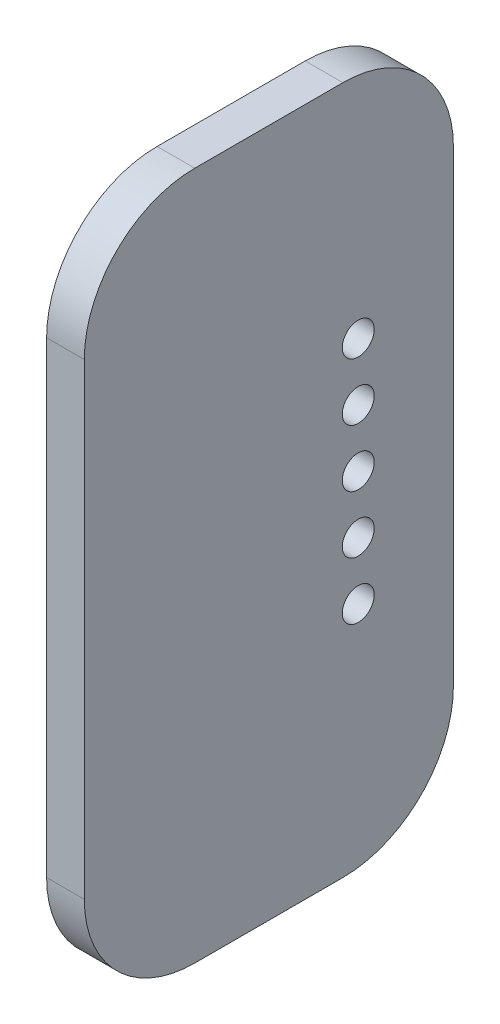
ISO-10303-21;
HEADER;
FILE_DESCRIPTION(('STEP AP214'),'2;1');
FILE_NAME('part.step','',(''),(''),'','','');
FILE_SCHEMA(('AUTOMOTIVE_DESIGN { 1 0 10303 214 1 1 1 1 }'));
ENDSEC;
DATA;
#1=APPLICATION_CONTEXT('core data for automotive mechanical design processes');
#2=APPLICATION_PROTOCOL_DEFINITION('international standard','automotive_design',2000,#1);
#3=PRODUCT_CONTEXT('',#1,'mechanical');
#4=PRODUCT('Part','Part','',(#3));
#5=PRODUCT_RELATED_PRODUCT_CATEGORY('part','',(#4));
#6=PRODUCT_DEFINITION_FORMATION('','',#4);
#7=PRODUCT_DEFINITION_CONTEXT('part definition',#1,'design');
#8=PRODUCT_DEFINITION('design','',#6,#7);
#9=PRODUCT_DEFINITION_SHAPE('','',#8);
#10=(LENGTH_UNIT() NAMED_UNIT(*) SI_UNIT(.MILLI.,.METRE.));
#11=(NAMED_UNIT(*) PLANE_ANGLE_UNIT() SI_UNIT($,.RADIAN.));
#12=(NAMED_UNIT(*) SI_UNIT($,.STERADIAN.) SOLID_ANGLE_UNIT());
#13=UNCERTAINTY_MEASURE_WITH_UNIT(LENGTH_MEASURE(1.E-05),#10,'distance_accuracy_value','');
#14=(GEOMETRIC_REPRESENTATION_CONTEXT(3) GLOBAL_UNCERTAINTY_ASSIGNED_CONTEXT((#13)) GLOBAL_UNIT_ASSIGNED_CONTEXT((#10,
#11,#12)) REPRESENTATION_CONTEXT('',''));
#15=CARTESIAN_POINT('',(0.,0.,0.));
#16=DIRECTION('',(0.,0.,1.));
#17=DIRECTION('',(1.,0.,0.));
#18=AXIS2_PLACEMENT_3D('',#15,#16,#17);
#19=CARTESIAN_POINT('',(36.95,-18.3000899385989,26.1999100614011));
#20=DIRECTION('',(-1.,0.,0.));
#21=DIRECTION('',(0.,0.,1.));
#22=AXIS2_PLACEMENT_3D('',#19,#20,#21);
#23=CYLINDRICAL_SURFACE('',#22,8.64991006186864);
#24=CARTESIAN_POINT('',(34.,-18.3000899385989,26.1999100614011));
#25=DIRECTION('',(1.,0.,0.));
#26=DIRECTION('',(0.,0.,-1.));
#27=AXIS2_PLACEMENT_3D('',#24,#25,#26);
#28=CIRCLE('',#27,8.64991006186864);
#29=CARTESIAN_POINT('',(34.,-26.95,26.2));
#30=VERTEX_POINT('',#29);
#31=CARTESIAN_POINT('',(34.,-18.3,17.55));
#32=VERTEX_POINT('',#31);
#33=EDGE_CURVE('E139',#30,#32,#28,.T.);
#34=ORIENTED_EDGE('',*,*,#33,.T.);
#35=DIRECTION('',(-1.,0.,0.));
#36=VECTOR('',#35,1.);
#37=CARTESIAN_POINT('',(36.95,-18.3,17.55));
#38=LINE('',#37,#36);
#39=CARTESIAN_POINT('',(36.95,-18.3,17.55));
#40=VERTEX_POINT('',#39);
#41=EDGE_CURVE('E11',#40,#32,#38,.T.);
#42=ORIENTED_EDGE('',*,*,#41,.F.);
#43=CARTESIAN_POINT('',(36.95,-18.3000899385989,26.1999100614011));
#44=DIRECTION('',(1.,0.,0.));
#45=DIRECTION('',(0.,0.,-1.));
#46=AXIS2_PLACEMENT_3D('',#43,#44,#45);
#47=CIRCLE('',#46,8.64991006186864);
#48=CARTESIAN_POINT('',(36.95,-26.95,26.2));
#49=VERTEX_POINT('',#48);
#50=EDGE_CURVE('E155',#49,#40,#47,.T.);
#51=ORIENTED_EDGE('',*,*,#50,.F.);
#52=DIRECTION('',(-1.,0.,0.));
#53=VECTOR('',#52,1.);
#54=CARTESIAN_POINT('',(36.95,-26.95,26.2));
#55=LINE('',#54,#53);
#56=EDGE_CURVE('E134',#49,#30,#55,.T.);
#57=ORIENTED_EDGE('',*,*,#56,.T.);
#58=EDGE_LOOP('',(#34,#42,#51,#57));
#59=FACE_BOUND('',#58,.T.);
#60=ADVANCED_FACE('F39',(#59),#23,.T.);
#61=CARTESIAN_POINT('',(36.95,-18.3,17.55));
#62=DIRECTION('',(0.,0.,1.));
#63=DIRECTION('',(1.,0.,0.));
#64=AXIS2_PLACEMENT_3D('',#61,#62,#63);
#65=PLANE('',#64);
#66=DIRECTION('',(0.,1.,0.));
#67=VECTOR('',#66,1.);
#68=CARTESIAN_POINT('',(34.,-18.3,17.55));
#69=LINE('',#68,#67);
#70=CARTESIAN_POINT('',(34.,18.3,17.55));
#71=VERTEX_POINT('',#70);
#72=EDGE_CURVE('E136',#32,#71,#69,.T.);
#73=ORIENTED_EDGE('',*,*,#72,.T.);
#74=DIRECTION('',(-1.,0.,0.));
#75=VECTOR('',#74,1.);
#76=CARTESIAN_POINT('',(36.95,18.3,17.55));
#77=LINE('',#76,#75);
#78=CARTESIAN_POINT('',(36.95,18.3,17.55));
#79=VERTEX_POINT('',#78);
#80=EDGE_CURVE('E48',#79,#71,#77,.T.);
#81=ORIENTED_EDGE('',*,*,#80,.F.);
#82=DIRECTION('',(0.,1.,0.));
#83=VECTOR('',#82,1.);
#84=CARTESIAN_POINT('',(36.95,-18.3,17.55));
#85=LINE('',#84,#83);
#86=EDGE_CURVE('E99',#40,#79,#85,.T.);
#87=ORIENTED_EDGE('',*,*,#86,.F.);
#88=ORIENTED_EDGE('',*,*,#41,.T.);
#89=EDGE_LOOP('',(#73,#81,#87,#88));
#90=FACE_BOUND('',#89,.T.);
#91=ADVANCED_FACE('F229',(#90),#65,.F.);
#92=CARTESIAN_POINT('',(36.95,18.3000899385989,26.1999100614011));
#93=DIRECTION('',(-1.,0.,0.));
#94=DIRECTION('',(0.,0.,1.));
#95=AXIS2_PLACEMENT_3D('',#92,#93,#94);
#96=CYLINDRICAL_SURFACE('',#95,8.64991006186864);
#97=CARTESIAN_POINT('',(34.,18.3000899385989,26.1999100614011));
#98=DIRECTION('',(1.,0.,0.));
#99=DIRECTION('',(0.,0.,-1.));
#100=AXIS2_PLACEMENT_3D('',#97,#98,#99);
#101=CIRCLE('',#100,8.64991006186864);
#102=CARTESIAN_POINT('',(34.,26.95,26.2));
#103=VERTEX_POINT('',#102);
#104=EDGE_CURVE('E141',#71,#103,#101,.T.);
#105=ORIENTED_EDGE('',*,*,#104,.T.);
#106=DIRECTION('',(-1.,0.,0.));
#107=VECTOR('',#106,1.);
#108=CARTESIAN_POINT('',(36.95,26.95,26.2));
#109=LINE('',#108,#107);
#110=CARTESIAN_POINT('',(36.95,26.95,26.2));
#111=VERTEX_POINT('',#110);
#112=EDGE_CURVE('E157',#111,#103,#109,.T.);
#113=ORIENTED_EDGE('',*,*,#112,.F.);
#114=CARTESIAN_POINT('',(36.95,18.3000899385989,26.1999100614011));
#115=DIRECTION('',(1.,0.,0.));
#116=DIRECTION('',(0.,0.,-1.));
#117=AXIS2_PLACEMENT_3D('',#114,#115,#116);
#118=CIRCLE('',#117,8.64991006186864);
#119=EDGE_CURVE('E198',#79,#111,#118,.T.);
#120=ORIENTED_EDGE('',*,*,#119,.F.);
#121=ORIENTED_EDGE('',*,*,#80,.T.);
#122=EDGE_LOOP('',(#105,#113,#120,#121));
#123=FACE_BOUND('',#122,.T.);
#124=ADVANCED_FACE('F234',(#123),#96,.T.);
#125=CARTESIAN_POINT('',(36.95,26.95,26.2));
#126=DIRECTION('',(0.,-1.,0.));
#127=DIRECTION('',(0.,0.,-1.));
#128=AXIS2_PLACEMENT_3D('',#125,#126,#127);
#129=PLANE('',#128);
#130=DIRECTION('',(0.,0.,1.));
#131=VECTOR('',#130,1.);
#132=CARTESIAN_POINT('',(34.,26.95,26.2));
#133=LINE('',#132,#131);
#134=CARTESIAN_POINT('',(34.,26.95,37.8));
#135=VERTEX_POINT('',#134);
#136=EDGE_CURVE('E144',#103,#135,#133,.T.);
#137=ORIENTED_EDGE('',*,*,#136,.T.);
#138=DIRECTION('',(-1.,0.,0.));
#139=VECTOR('',#138,1.);
#140=CARTESIAN_POINT('',(36.95,26.95,37.8));
#141=LINE('',#140,#139);
#142=CARTESIAN_POINT('',(36.95,26.95,37.8));
#143=VERTEX_POINT('',#142);
#144=EDGE_CURVE('E156',#143,#135,#141,.T.);
#145=ORIENTED_EDGE('',*,*,#144,.F.);
#146=DIRECTION('',(0.,0.,1.));
#147=VECTOR('',#146,1.);
#148=CARTESIAN_POINT('',(36.95,26.95,26.2));
#149=LINE('',#148,#147);
#150=EDGE_CURVE('E196',#111,#143,#149,.T.);
#151=ORIENTED_EDGE('',*,*,#150,.F.);
#152=ORIENTED_EDGE('',*,*,#112,.T.);
#153=EDGE_LOOP('',(#137,#145,#151,#152));
#154=FACE_BOUND('',#153,.T.);
#155=ADVANCED_FACE('F204',(#154),#129,.F.);
#156=CARTESIAN_POINT('',(36.95,18.3000899385989,37.8000899385989));
#157=DIRECTION('',(-1.,0.,0.));
#158=DIRECTION('',(0.,0.,1.));
#159=AXIS2_PLACEMENT_3D('',#156,#157,#158);
#160=CYLINDRICAL_SURFACE('',#159,8.64991006186864);
#161=CARTESIAN_POINT('',(34.,18.3000899385989,37.8000899385989));
#162=DIRECTION('',(1.,0.,0.));
#163=DIRECTION('',(0.,0.,-1.));
#164=AXIS2_PLACEMENT_3D('',#161,#162,#163);
#165=CIRCLE('',#164,8.64991006186864);
#166=CARTESIAN_POINT('',(34.,18.3,46.45));
#167=VERTEX_POINT('',#166);
#168=EDGE_CURVE('E150',#135,#167,#165,.T.);
#169=ORIENTED_EDGE('',*,*,#168,.T.);
#170=DIRECTION('',(-1.,0.,0.));
#171=VECTOR('',#170,1.);
#172=CARTESIAN_POINT('',(36.95,18.3,46.45));
#173=LINE('',#172,#171);
#174=CARTESIAN_POINT('',(36.95,18.3,46.45));
#175=VERTEX_POINT('',#174);
#176=EDGE_CURVE('E126',#175,#167,#173,.T.);
#177=ORIENTED_EDGE('',*,*,#176,.F.);
#178=CARTESIAN_POINT('',(36.95,18.3000899385989,37.8000899385989));
#179=DIRECTION('',(1.,0.,0.));
#180=DIRECTION('',(0.,0.,-1.));
#181=AXIS2_PLACEMENT_3D('',#178,#179,#180);
#182=CIRCLE('',#181,8.64991006186864);
#183=EDGE_CURVE('E118',#143,#175,#182,.T.);
#184=ORIENTED_EDGE('',*,*,#183,.F.);
#185=ORIENTED_EDGE('',*,*,#144,.T.);
#186=EDGE_LOOP('',(#169,#177,#184,#185));
#187=FACE_BOUND('',#186,.T.);
#188=ADVANCED_FACE('F208',(#187),#160,.T.);
#189=CARTESIAN_POINT('',(36.95,18.3,46.45));
#190=DIRECTION('',(0.,0.,-1.));
#191=DIRECTION('',(-1.,0.,0.));
#192=AXIS2_PLACEMENT_3D('',#189,#190,#191);
#193=PLANE('',#192);
#194=DIRECTION('',(0.,-1.,0.));
#195=VECTOR('',#194,1.);
#196=CARTESIAN_POINT('',(34.,18.3,46.45));
#197=LINE('',#196,#195);
#198=CARTESIAN_POINT('',(34.,-18.3,46.45));
#199=VERTEX_POINT('',#198);
#200=EDGE_CURVE('E130',#167,#199,#197,.T.);
#201=ORIENTED_EDGE('',*,*,#200,.T.);
#202=DIRECTION('',(-1.,0.,0.));
#203=VECTOR('',#202,1.);
#204=CARTESIAN_POINT('',(36.95,-18.3,46.45));
#205=LINE('',#204,#203);
#206=CARTESIAN_POINT('',(36.95,-18.3,46.45));
#207=VERTEX_POINT('',#206);
#208=EDGE_CURVE('E125',#207,#199,#205,.T.);
#209=ORIENTED_EDGE('',*,*,#208,.F.);
#210=DIRECTION('',(0.,-1.,0.));
#211=VECTOR('',#210,1.);
#212=CARTESIAN_POINT('',(36.95,18.3,46.45));
#213=LINE('',#212,#211);
#214=EDGE_CURVE('E114',#175,#207,#213,.T.);
#215=ORIENTED_EDGE('',*,*,#214,.F.);
#216=ORIENTED_EDGE('',*,*,#176,.T.);
#217=EDGE_LOOP('',(#201,#209,#215,#216));
#218=FACE_BOUND('',#217,.T.);
#219=ADVANCED_FACE('F121',(#218),#193,.F.);
#220=CARTESIAN_POINT('',(36.95,-18.3000899385989,37.8000899385989));
#221=DIRECTION('',(-1.,0.,0.));
#222=DIRECTION('',(0.,0.,1.));
#223=AXIS2_PLACEMENT_3D('',#220,#221,#222);
#224=CYLINDRICAL_SURFACE('',#223,8.64991006186865);
#225=CARTESIAN_POINT('',(34.,-18.3000899385989,37.8000899385989));
#226=DIRECTION('',(1.,0.,0.));
#227=DIRECTION('',(0.,0.,-1.));
#228=AXIS2_PLACEMENT_3D('',#225,#226,#227);
#229=CIRCLE('',#228,8.64991006186865);
#230=CARTESIAN_POINT('',(34.,-26.95,37.8));
#231=VERTEX_POINT('',#230);
#232=EDGE_CURVE('E88',#199,#231,#229,.T.);
#233=ORIENTED_EDGE('',*,*,#232,.T.);
#234=DIRECTION('',(-1.,0.,0.));
#235=VECTOR('',#234,1.);
#236=CARTESIAN_POINT('',(36.95,-26.95,37.8));
#237=LINE('',#236,#235);
#238=CARTESIAN_POINT('',(36.95,-26.95,37.8));
#239=VERTEX_POINT('',#238);
#240=EDGE_CURVE('E129',#239,#231,#237,.T.);
#241=ORIENTED_EDGE('',*,*,#240,.F.);
#242=CARTESIAN_POINT('',(36.95,-18.3000899385989,37.8000899385989));
#243=DIRECTION('',(1.,0.,0.));
#244=DIRECTION('',(0.,0.,-1.));
#245=AXIS2_PLACEMENT_3D('',#242,#243,#244);
#246=CIRCLE('',#245,8.64991006186865);
#247=EDGE_CURVE('E117',#207,#239,#246,.T.);
#248=ORIENTED_EDGE('',*,*,#247,.F.);
#249=ORIENTED_EDGE('',*,*,#208,.T.);
#250=EDGE_LOOP('',(#233,#241,#248,#249));
#251=FACE_BOUND('',#250,.T.);
#252=ADVANCED_FACE('F131',(#251),#224,.T.);
#253=CARTESIAN_POINT('',(36.95,-26.95,37.8));
#254=DIRECTION('',(0.,1.,0.));
#255=DIRECTION('',(0.,0.,1.));
#256=AXIS2_PLACEMENT_3D('',#253,#254,#255);
#257=PLANE('',#256);
#258=DIRECTION('',(0.,0.,-1.));
#259=VECTOR('',#258,1.);
#260=CARTESIAN_POINT('',(34.,-26.95,37.8));
#261=LINE('',#260,#259);
#262=EDGE_CURVE('E95',#231,#30,#261,.T.);
#263=ORIENTED_EDGE('',*,*,#262,.T.);
#264=ORIENTED_EDGE('',*,*,#56,.F.);
#265=DIRECTION('',(0.,0.,-1.));
#266=VECTOR('',#265,1.);
#267=CARTESIAN_POINT('',(36.95,-26.95,37.8));
#268=LINE('',#267,#266);
#269=EDGE_CURVE('E60',#239,#49,#268,.T.);
#270=ORIENTED_EDGE('',*,*,#269,.F.);
#271=ORIENTED_EDGE('',*,*,#240,.T.);
#272=EDGE_LOOP('',(#263,#264,#270,#271));
#273=FACE_BOUND('',#272,.T.);
#274=ADVANCED_FACE('F216',(#273),#257,.F.);
#275=CARTESIAN_POINT('',(36.95,-18.3000899385989,26.1999100614011));
#276=DIRECTION('',(1.,0.,0.));
#277=DIRECTION('',(0.,0.,-1.));
#278=AXIS2_PLACEMENT_3D('',#275,#276,#277);
#279=PLANE('',#278);
#280=CARTESIAN_POINT('',(36.95,9.,25.));
#281=DIRECTION('',(1.,0.,0.));
#282=DIRECTION('',(0.,0.,-1.));
#283=AXIS2_PLACEMENT_3D('',#280,#281,#282);
#284=CIRCLE('',#283,1.25);
#285=CARTESIAN_POINT('',(36.95,9.,23.75));
#286=VERTEX_POINT('',#285);
#287=EDGE_CURVE('E179',#286,#286,#284,.F.);
#288=ORIENTED_EDGE('',*,*,#287,.T.);
#289=EDGE_LOOP('',(#288));
#290=FACE_BOUND('',#289,.T.);
#291=CARTESIAN_POINT('',(36.95,4.5,25.));
#292=DIRECTION('',(1.,0.,0.));
#293=DIRECTION('',(0.,0.,-1.));
#294=AXIS2_PLACEMENT_3D('',#291,#292,#293);
#295=CIRCLE('',#294,1.25);
#296=CARTESIAN_POINT('',(36.95,4.5,23.75));
#297=VERTEX_POINT('',#296);
#298=EDGE_CURVE('E173',#297,#297,#295,.F.);
#299=ORIENTED_EDGE('',*,*,#298,.T.);
#300=EDGE_LOOP('',(#299));
#301=FACE_BOUND('',#300,.T.);
#302=CARTESIAN_POINT('',(36.95,0.,25.));
#303=DIRECTION('',(1.,0.,0.));
#304=DIRECTION('',(0.,0.,-1.));
#305=AXIS2_PLACEMENT_3D('',#302,#303,#304);
#306=CIRCLE('',#305,1.25);
#307=CARTESIAN_POINT('',(36.95,0.,23.75));
#308=VERTEX_POINT('',#307);
#309=EDGE_CURVE('E171',#308,#308,#306,.F.);
#310=ORIENTED_EDGE('',*,*,#309,.T.);
#311=EDGE_LOOP('',(#310));
#312=FACE_BOUND('',#311,.T.);
#313=CARTESIAN_POINT('',(36.95,-4.5,25.));
#314=DIRECTION('',(1.,0.,0.));
#315=DIRECTION('',(0.,0.,-1.));
#316=AXIS2_PLACEMENT_3D('',#313,#314,#315);
#317=CIRCLE('',#316,1.25);
#318=CARTESIAN_POINT('',(36.95,-4.5,23.75));
#319=VERTEX_POINT('',#318);
#320=EDGE_CURVE('E170',#319,#319,#317,.F.);
#321=ORIENTED_EDGE('',*,*,#320,.T.);
#322=EDGE_LOOP('',(#321));
#323=FACE_BOUND('',#322,.T.);
#324=CARTESIAN_POINT('',(36.95,-9.,25.));
#325=DIRECTION('',(1.,0.,0.));
#326=DIRECTION('',(0.,0.,-1.));
#327=AXIS2_PLACEMENT_3D('',#324,#325,#326);
#328=CIRCLE('',#327,1.25);
#329=CARTESIAN_POINT('',(36.95,-9.,23.75));
#330=VERTEX_POINT('',#329);
#331=EDGE_CURVE('E143',#330,#330,#328,.F.);
#332=ORIENTED_EDGE('',*,*,#331,.T.);
#333=EDGE_LOOP('',(#332));
#334=FACE_BOUND('',#333,.T.);
#335=ORIENTED_EDGE('',*,*,#50,.T.);
#336=ORIENTED_EDGE('',*,*,#86,.T.);
#337=ORIENTED_EDGE('',*,*,#119,.T.);
#338=ORIENTED_EDGE('',*,*,#150,.T.);
#339=ORIENTED_EDGE('',*,*,#183,.T.);
#340=ORIENTED_EDGE('',*,*,#214,.T.);
#341=ORIENTED_EDGE('',*,*,#247,.T.);
#342=ORIENTED_EDGE('',*,*,#269,.T.);
#343=EDGE_LOOP('',(#335,#336,#337,#338,#339,#340,#341,#342));
#344=FACE_BOUND('',#343,.T.);
#345=ADVANCED_FACE('F113',(#290,#301,#312,#323,#334,#344),#279,.T.);
#346=CARTESIAN_POINT('',(34.,-18.3000899385989,26.1999100614011));
#347=DIRECTION('',(1.,0.,0.));
#348=DIRECTION('',(0.,0.,-1.));
#349=AXIS2_PLACEMENT_3D('',#346,#347,#348);
#350=PLANE('',#349);
#351=CARTESIAN_POINT('',(34.,9.,25.));
#352=DIRECTION('',(1.,0.,0.));
#353=DIRECTION('',(0.,0.,-1.));
#354=AXIS2_PLACEMENT_3D('',#351,#352,#353);
#355=CIRCLE('',#354,1.25);
#356=CARTESIAN_POINT('',(34.,9.,23.75));
#357=VERTEX_POINT('',#356);
#358=EDGE_CURVE('E45',#357,#357,#355,.F.);
#359=ORIENTED_EDGE('',*,*,#358,.F.);
#360=EDGE_LOOP('',(#359));
#361=FACE_BOUND('',#360,.T.);
#362=CARTESIAN_POINT('',(34.,4.5,25.));
#363=DIRECTION('',(1.,0.,0.));
#364=DIRECTION('',(0.,0.,-1.));
#365=AXIS2_PLACEMENT_3D('',#362,#363,#364);
#366=CIRCLE('',#365,1.25);
#367=CARTESIAN_POINT('',(34.,4.5,23.75));
#368=VERTEX_POINT('',#367);
#369=EDGE_CURVE('E175',#368,#368,#366,.F.);
#370=ORIENTED_EDGE('',*,*,#369,.F.);
#371=EDGE_LOOP('',(#370));
#372=FACE_BOUND('',#371,.T.);
#373=CARTESIAN_POINT('',(34.,0.,25.));
#374=DIRECTION('',(1.,0.,0.));
#375=DIRECTION('',(0.,0.,-1.));
#376=AXIS2_PLACEMENT_3D('',#373,#374,#375);
#377=CIRCLE('',#376,1.25);
#378=CARTESIAN_POINT('',(34.,0.,23.75));
#379=VERTEX_POINT('',#378);
#380=EDGE_CURVE('E172',#379,#379,#377,.F.);
#381=ORIENTED_EDGE('',*,*,#380,.F.);
#382=EDGE_LOOP('',(#381));
#383=FACE_BOUND('',#382,.T.);
#384=CARTESIAN_POINT('',(34.,-4.5,25.));
#385=DIRECTION('',(1.,0.,0.));
#386=DIRECTION('',(0.,0.,-1.));
#387=AXIS2_PLACEMENT_3D('',#384,#385,#386);
#388=CIRCLE('',#387,1.25);
#389=CARTESIAN_POINT('',(34.,-4.5,23.75));
#390=VERTEX_POINT('',#389);
#391=EDGE_CURVE('E169',#390,#390,#388,.F.);
#392=ORIENTED_EDGE('',*,*,#391,.F.);
#393=EDGE_LOOP('',(#392));
#394=FACE_BOUND('',#393,.T.);
#395=CARTESIAN_POINT('',(34.,-9.,25.));
#396=DIRECTION('',(1.,0.,0.));
#397=DIRECTION('',(0.,0.,-1.));
#398=AXIS2_PLACEMENT_3D('',#395,#396,#397);
#399=CIRCLE('',#398,1.25);
#400=CARTESIAN_POINT('',(34.,-9.,23.75));
#401=VERTEX_POINT('',#400);
#402=EDGE_CURVE('E163',#401,#401,#399,.F.);
#403=ORIENTED_EDGE('',*,*,#402,.F.);
#404=EDGE_LOOP('',(#403));
#405=FACE_BOUND('',#404,.T.);
#406=ORIENTED_EDGE('',*,*,#33,.F.);
#407=ORIENTED_EDGE('',*,*,#262,.F.);
#408=ORIENTED_EDGE('',*,*,#232,.F.);
#409=ORIENTED_EDGE('',*,*,#200,.F.);
#410=ORIENTED_EDGE('',*,*,#168,.F.);
#411=ORIENTED_EDGE('',*,*,#136,.F.);
#412=ORIENTED_EDGE('',*,*,#104,.F.);
#413=ORIENTED_EDGE('',*,*,#72,.F.);
#414=EDGE_LOOP('',(#406,#407,#408,#409,#410,#411,#412,#413));
#415=FACE_BOUND('',#414,.T.);
#416=ADVANCED_FACE('F211',(#361,#372,#383,#394,#405,#415),#350,.F.);
#417=CARTESIAN_POINT('',(37.1,-9.,25.));
#418=DIRECTION('',(-1.,0.,0.));
#419=DIRECTION('',(0.,0.,1.));
#420=AXIS2_PLACEMENT_3D('',#417,#418,#419);
#421=CYLINDRICAL_SURFACE('',#420,1.25);
#422=ORIENTED_EDGE('',*,*,#331,.F.);
#423=EDGE_LOOP('',(#422));
#424=FACE_BOUND('',#423,.T.);
#425=ORIENTED_EDGE('',*,*,#402,.T.);
#426=EDGE_LOOP('',(#425));
#427=FACE_BOUND('',#426,.T.);
#428=ADVANCED_FACE('F273',(#424,#427),#421,.F.);
#429=CARTESIAN_POINT('',(37.1,-4.5,25.));
#430=DIRECTION('',(-1.,0.,0.));
#431=DIRECTION('',(0.,0.,1.));
#432=AXIS2_PLACEMENT_3D('',#429,#430,#431);
#433=CYLINDRICAL_SURFACE('',#432,1.25);
#434=ORIENTED_EDGE('',*,*,#320,.F.);
#435=EDGE_LOOP('',(#434));
#436=FACE_BOUND('',#435,.T.);
#437=ORIENTED_EDGE('',*,*,#391,.T.);
#438=EDGE_LOOP('',(#437));
#439=FACE_BOUND('',#438,.T.);
#440=ADVANCED_FACE('F284',(#436,#439),#433,.F.);
#441=CARTESIAN_POINT('',(37.1,0.,25.));
#442=DIRECTION('',(-1.,0.,0.));
#443=DIRECTION('',(0.,0.,1.));
#444=AXIS2_PLACEMENT_3D('',#441,#442,#443);
#445=CYLINDRICAL_SURFACE('',#444,1.25);
#446=ORIENTED_EDGE('',*,*,#309,.F.);
#447=EDGE_LOOP('',(#446));
#448=FACE_BOUND('',#447,.T.);
#449=ORIENTED_EDGE('',*,*,#380,.T.);
#450=EDGE_LOOP('',(#449));
#451=FACE_BOUND('',#450,.T.);
#452=ADVANCED_FACE('F291',(#448,#451),#445,.F.);
#453=CARTESIAN_POINT('',(37.1,4.5,25.));
#454=DIRECTION('',(-1.,0.,0.));
#455=DIRECTION('',(0.,0.,1.));
#456=AXIS2_PLACEMENT_3D('',#453,#454,#455);
#457=CYLINDRICAL_SURFACE('',#456,1.25);
#458=ORIENTED_EDGE('',*,*,#298,.F.);
#459=EDGE_LOOP('',(#458));
#460=FACE_BOUND('',#459,.T.);
#461=ORIENTED_EDGE('',*,*,#369,.T.);
#462=EDGE_LOOP('',(#461));
#463=FACE_BOUND('',#462,.T.);
#464=ADVANCED_FACE('F302',(#460,#463),#457,.F.);
#465=CARTESIAN_POINT('',(37.1,9.,25.));
#466=DIRECTION('',(-1.,0.,0.));
#467=DIRECTION('',(0.,0.,1.));
#468=AXIS2_PLACEMENT_3D('',#465,#466,#467);
#469=CYLINDRICAL_SURFACE('',#468,1.25);
#470=ORIENTED_EDGE('',*,*,#287,.F.);
#471=EDGE_LOOP('',(#470));
#472=FACE_BOUND('',#471,.T.);
#473=ORIENTED_EDGE('',*,*,#358,.T.);
#474=EDGE_LOOP('',(#473));
#475=FACE_BOUND('',#474,.T.);
#476=ADVANCED_FACE('F315',(#472,#475),#469,.F.);
#477=CLOSED_SHELL('',(#60,#91,#124,#155,#188,#219,#252,#274,#345,#416,#428,#440,#452,#464,#476));
#478=MANIFOLD_SOLID_BREP('B2',#477);
#479=ADVANCED_BREP_SHAPE_REPRESENTATION('',(#18,#478),#14);
#480=SHAPE_DEFINITION_REPRESENTATION(#9,#479);
ENDSEC;
END-ISO-10303-21;
